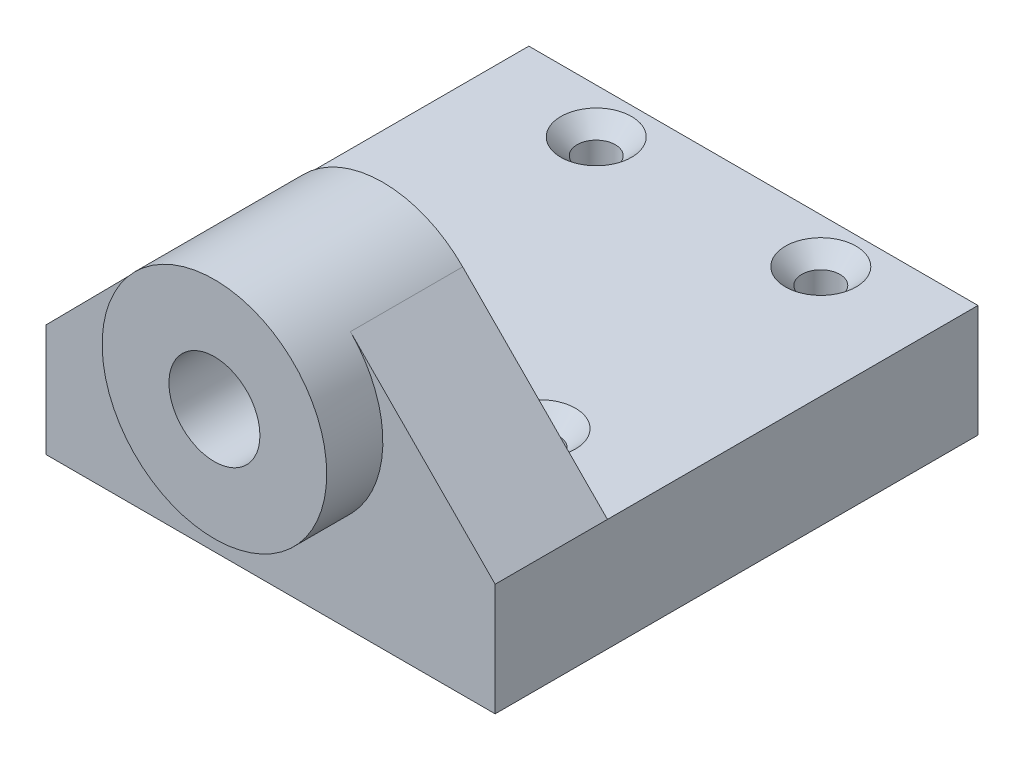
ISO-10303-21;
HEADER;
FILE_DESCRIPTION(('STEP AP214'),'2;1');
FILE_NAME('part.step','',(''),(''),'','','');
FILE_SCHEMA(('AUTOMOTIVE_DESIGN { 1 0 10303 214 1 1 1 1 }'));
ENDSEC;
DATA;
#1=APPLICATION_CONTEXT('core data for automotive mechanical design processes');
#2=APPLICATION_PROTOCOL_DEFINITION('international standard','automotive_design',2000,#1);
#3=PRODUCT_CONTEXT('',#1,'mechanical');
#4=PRODUCT('Part','Part','',(#3));
#5=PRODUCT_RELATED_PRODUCT_CATEGORY('part','',(#4));
#6=PRODUCT_DEFINITION_FORMATION('','',#4);
#7=PRODUCT_DEFINITION_CONTEXT('part definition',#1,'design');
#8=PRODUCT_DEFINITION('design','',#6,#7);
#9=PRODUCT_DEFINITION_SHAPE('','',#8);
#10=(LENGTH_UNIT() NAMED_UNIT(*) SI_UNIT(.MILLI.,.METRE.));
#11=(NAMED_UNIT(*) PLANE_ANGLE_UNIT() SI_UNIT($,.RADIAN.));
#12=(NAMED_UNIT(*) SI_UNIT($,.STERADIAN.) SOLID_ANGLE_UNIT());
#13=UNCERTAINTY_MEASURE_WITH_UNIT(LENGTH_MEASURE(1.E-05),#10,'distance_accuracy_value','');
#14=(GEOMETRIC_REPRESENTATION_CONTEXT(3) GLOBAL_UNCERTAINTY_ASSIGNED_CONTEXT((#13)) GLOBAL_UNIT_ASSIGNED_CONTEXT((#10,
#11,#12)) REPRESENTATION_CONTEXT('',''));
#15=CARTESIAN_POINT('',(0.,0.,0.));
#16=DIRECTION('',(0.,0.,1.));
#17=DIRECTION('',(1.,0.,0.));
#18=AXIS2_PLACEMENT_3D('',#15,#16,#17);
#19=CARTESIAN_POINT('',(0.,10.,0.));
#20=DIRECTION('',(1.,0.,0.));
#21=DIRECTION('',(0.,0.,-1.));
#22=AXIS2_PLACEMENT_3D('',#19,#20,#21);
#23=PLANE('',#22);
#24=DIRECTION('',(0.,0.,1.));
#25=VECTOR('',#24,1.);
#26=CARTESIAN_POINT('',(0.,0.,0.));
#27=LINE('',#26,#25);
#28=CARTESIAN_POINT('',(0.,0.,-33.));
#29=VERTEX_POINT('',#28);
#30=CARTESIAN_POINT('',(0.,0.,10.));
#31=VERTEX_POINT('',#30);
#32=EDGE_CURVE('E127',#29,#31,#27,.T.);
#33=ORIENTED_EDGE('',*,*,#32,.T.);
#34=DIRECTION('',(0.,-1.,0.));
#35=VECTOR('',#34,1.);
#36=CARTESIAN_POINT('',(0.,10.,10.));
#37=LINE('',#36,#35);
#38=CARTESIAN_POINT('',(0.,10.,10.));
#39=VERTEX_POINT('',#38);
#40=EDGE_CURVE('E146',#39,#31,#37,.T.);
#41=ORIENTED_EDGE('',*,*,#40,.F.);
#42=DIRECTION('',(0.,0.,-1.));
#43=VECTOR('',#42,1.);
#44=CARTESIAN_POINT('',(0.,10.,10.));
#45=LINE('',#44,#43);
#46=CARTESIAN_POINT('',(0.,10.,0.));
#47=VERTEX_POINT('',#46);
#48=EDGE_CURVE('E113',#39,#47,#45,.T.);
#49=ORIENTED_EDGE('',*,*,#48,.T.);
#50=DIRECTION('',(0.,0.,1.));
#51=VECTOR('',#50,1.);
#52=CARTESIAN_POINT('',(0.,10.,0.));
#53=LINE('',#52,#51);
#54=CARTESIAN_POINT('',(0.,10.,-33.));
#55=VERTEX_POINT('',#54);
#56=EDGE_CURVE('E119',#55,#47,#53,.T.);
#57=ORIENTED_EDGE('',*,*,#56,.F.);
#58=DIRECTION('',(0.,-1.,0.));
#59=VECTOR('',#58,1.);
#60=CARTESIAN_POINT('',(0.,10.,-33.));
#61=LINE('',#60,#59);
#62=EDGE_CURVE('E123',#55,#29,#61,.T.);
#63=ORIENTED_EDGE('',*,*,#62,.T.);
#64=EDGE_LOOP('',(#33,#41,#49,#57,#63));
#65=FACE_BOUND('',#64,.T.);
#66=ADVANCED_FACE('F37',(#65),#23,.F.);
#67=CARTESIAN_POINT('',(40.,10.,0.));
#68=DIRECTION('',(-1.,0.,0.));
#69=DIRECTION('',(0.,0.,1.));
#70=AXIS2_PLACEMENT_3D('',#67,#68,#69);
#71=PLANE('',#70);
#72=DIRECTION('',(0.,0.,-1.));
#73=VECTOR('',#72,1.);
#74=CARTESIAN_POINT('',(40.,0.,0.));
#75=LINE('',#74,#73);
#76=CARTESIAN_POINT('',(40.,0.,10.));
#77=VERTEX_POINT('',#76);
#78=CARTESIAN_POINT('',(40.,0.,-33.));
#79=VERTEX_POINT('',#78);
#80=EDGE_CURVE('E66',#77,#79,#75,.T.);
#81=ORIENTED_EDGE('',*,*,#80,.T.);
#82=DIRECTION('',(0.,-1.,0.));
#83=VECTOR('',#82,1.);
#84=CARTESIAN_POINT('',(40.,10.,-33.));
#85=LINE('',#84,#83);
#86=CARTESIAN_POINT('',(40.,10.,-33.));
#87=VERTEX_POINT('',#86);
#88=EDGE_CURVE('E40',#87,#79,#85,.T.);
#89=ORIENTED_EDGE('',*,*,#88,.F.);
#90=DIRECTION('',(0.,0.,-1.));
#91=VECTOR('',#90,1.);
#92=CARTESIAN_POINT('',(40.,10.,0.));
#93=LINE('',#92,#91);
#94=CARTESIAN_POINT('',(40.,10.,0.));
#95=VERTEX_POINT('',#94);
#96=EDGE_CURVE('E117',#95,#87,#93,.T.);
#97=ORIENTED_EDGE('',*,*,#96,.F.);
#98=DIRECTION('',(0.,0.,-1.));
#99=VECTOR('',#98,1.);
#100=CARTESIAN_POINT('',(40.,10.,10.));
#101=LINE('',#100,#99);
#102=CARTESIAN_POINT('',(40.,10.,10.));
#103=VERTEX_POINT('',#102);
#104=EDGE_CURVE('E109',#103,#95,#101,.T.);
#105=ORIENTED_EDGE('',*,*,#104,.F.);
#106=DIRECTION('',(0.,1.,0.));
#107=VECTOR('',#106,1.);
#108=CARTESIAN_POINT('',(40.,0.,10.));
#109=LINE('',#108,#107);
#110=EDGE_CURVE('E153',#77,#103,#109,.T.);
#111=ORIENTED_EDGE('',*,*,#110,.F.);
#112=EDGE_LOOP('',(#81,#89,#97,#105,#111));
#113=FACE_BOUND('',#112,.T.);
#114=ADVANCED_FACE('F121',(#113),#71,.F.);
#115=CARTESIAN_POINT('',(0.,10.,-33.));
#116=DIRECTION('',(0.,0.,1.));
#117=DIRECTION('',(1.,0.,0.));
#118=AXIS2_PLACEMENT_3D('',#115,#116,#117);
#119=PLANE('',#118);
#120=DIRECTION('',(-1.,0.,0.));
#121=VECTOR('',#120,1.);
#122=CARTESIAN_POINT('',(0.,0.,-33.));
#123=LINE('',#122,#121);
#124=EDGE_CURVE('E131',#79,#29,#123,.T.);
#125=ORIENTED_EDGE('',*,*,#124,.T.);
#126=ORIENTED_EDGE('',*,*,#62,.F.);
#127=DIRECTION('',(-1.,0.,0.));
#128=VECTOR('',#127,1.);
#129=CARTESIAN_POINT('',(0.,10.,-33.));
#130=LINE('',#129,#128);
#131=EDGE_CURVE('E54',#87,#55,#130,.T.);
#132=ORIENTED_EDGE('',*,*,#131,.F.);
#133=ORIENTED_EDGE('',*,*,#88,.T.);
#134=EDGE_LOOP('',(#125,#126,#132,#133));
#135=FACE_BOUND('',#134,.T.);
#136=ADVANCED_FACE('F137',(#135),#119,.F.);
#137=CARTESIAN_POINT('',(0.,10.,0.));
#138=DIRECTION('',(0.,-1.,0.));
#139=DIRECTION('',(0.,0.,-1.));
#140=AXIS2_PLACEMENT_3D('',#137,#138,#139);
#141=PLANE('',#140);
#142=CARTESIAN_POINT('',(10.,10.,-29.));
#143=DIRECTION('',(0.,1.,0.));
#144=DIRECTION('',(0.,0.,1.));
#145=AXIS2_PLACEMENT_3D('',#142,#143,#144);
#146=CIRCLE('',#145,3.15);
#147=CARTESIAN_POINT('',(10.,10.,-25.85));
#148=VERTEX_POINT('',#147);
#149=EDGE_CURVE('E214',#148,#148,#146,.T.);
#150=ORIENTED_EDGE('',*,*,#149,.F.);
#151=EDGE_LOOP('',(#150));
#152=FACE_BOUND('',#151,.T.);
#153=CARTESIAN_POINT('',(30.,10.,-29.));
#154=DIRECTION('',(0.,1.,0.));
#155=DIRECTION('',(0.,0.,1.));
#156=AXIS2_PLACEMENT_3D('',#153,#154,#155);
#157=CIRCLE('',#156,3.15);
#158=CARTESIAN_POINT('',(30.,10.,-25.85));
#159=VERTEX_POINT('',#158);
#160=EDGE_CURVE('E205',#159,#159,#157,.T.);
#161=ORIENTED_EDGE('',*,*,#160,.F.);
#162=EDGE_LOOP('',(#161));
#163=FACE_BOUND('',#162,.T.);
#164=CARTESIAN_POINT('',(30.,10.,-4.));
#165=DIRECTION('',(0.,1.,0.));
#166=DIRECTION('',(0.,0.,1.));
#167=AXIS2_PLACEMENT_3D('',#164,#165,#166);
#168=CIRCLE('',#167,3.15);
#169=CARTESIAN_POINT('',(30.,10.,-0.85));
#170=VERTEX_POINT('',#169);
#171=EDGE_CURVE('E196',#170,#170,#168,.T.);
#172=ORIENTED_EDGE('',*,*,#171,.F.);
#173=EDGE_LOOP('',(#172));
#174=FACE_BOUND('',#173,.T.);
#175=CARTESIAN_POINT('',(10.,10.,-4.));
#176=DIRECTION('',(0.,1.,0.));
#177=DIRECTION('',(0.,0.,1.));
#178=AXIS2_PLACEMENT_3D('',#175,#176,#177);
#179=CIRCLE('',#178,3.15);
#180=CARTESIAN_POINT('',(10.,10.,-0.85));
#181=VERTEX_POINT('',#180);
#182=EDGE_CURVE('E187',#181,#181,#179,.T.);
#183=ORIENTED_EDGE('',*,*,#182,.F.);
#184=EDGE_LOOP('',(#183));
#185=FACE_BOUND('',#184,.T.);
#186=ORIENTED_EDGE('',*,*,#56,.T.);
#187=DIRECTION('',(1.,0.,0.));
#188=VECTOR('',#187,1.);
#189=CARTESIAN_POINT('',(0.,10.,0.));
#190=LINE('',#189,#188);
#191=EDGE_CURVE('E99',#47,#95,#190,.T.);
#192=ORIENTED_EDGE('',*,*,#191,.T.);
#193=ORIENTED_EDGE('',*,*,#96,.T.);
#194=ORIENTED_EDGE('',*,*,#131,.T.);
#195=EDGE_LOOP('',(#186,#192,#193,#194));
#196=FACE_BOUND('',#195,.T.);
#197=ADVANCED_FACE('F116',(#152,#163,#174,#185,#196),#141,.F.);
#198=CARTESIAN_POINT('',(0.,0.,0.));
#199=DIRECTION('',(0.,-1.,0.));
#200=DIRECTION('',(0.,0.,-1.));
#201=AXIS2_PLACEMENT_3D('',#198,#199,#200);
#202=PLANE('',#201);
#203=CARTESIAN_POINT('',(10.,0.,-29.));
#204=DIRECTION('',(0.,1.,0.));
#205=DIRECTION('',(0.,0.,1.));
#206=AXIS2_PLACEMENT_3D('',#203,#204,#205);
#207=CIRCLE('',#206,1.7);
#208=CARTESIAN_POINT('',(10.,0.,-27.3));
#209=VERTEX_POINT('',#208);
#210=EDGE_CURVE('E220',#209,#209,#207,.T.);
#211=ORIENTED_EDGE('',*,*,#210,.T.);
#212=EDGE_LOOP('',(#211));
#213=FACE_BOUND('',#212,.T.);
#214=CARTESIAN_POINT('',(30.,0.,-29.));
#215=DIRECTION('',(0.,1.,0.));
#216=DIRECTION('',(0.,0.,1.));
#217=AXIS2_PLACEMENT_3D('',#214,#215,#216);
#218=CIRCLE('',#217,1.7);
#219=CARTESIAN_POINT('',(30.,0.,-27.3));
#220=VERTEX_POINT('',#219);
#221=EDGE_CURVE('E211',#220,#220,#218,.T.);
#222=ORIENTED_EDGE('',*,*,#221,.T.);
#223=EDGE_LOOP('',(#222));
#224=FACE_BOUND('',#223,.T.);
#225=CARTESIAN_POINT('',(30.,0.,-4.));
#226=DIRECTION('',(0.,1.,0.));
#227=DIRECTION('',(0.,0.,1.));
#228=AXIS2_PLACEMENT_3D('',#225,#226,#227);
#229=CIRCLE('',#228,1.7);
#230=CARTESIAN_POINT('',(30.,0.,-2.3));
#231=VERTEX_POINT('',#230);
#232=EDGE_CURVE('E202',#231,#231,#229,.T.);
#233=ORIENTED_EDGE('',*,*,#232,.T.);
#234=EDGE_LOOP('',(#233));
#235=FACE_BOUND('',#234,.T.);
#236=CARTESIAN_POINT('',(10.,0.,-4.));
#237=DIRECTION('',(0.,1.,0.));
#238=DIRECTION('',(0.,0.,1.));
#239=AXIS2_PLACEMENT_3D('',#236,#237,#238);
#240=CIRCLE('',#239,1.7);
#241=CARTESIAN_POINT('',(10.,0.,-2.3));
#242=VERTEX_POINT('',#241);
#243=EDGE_CURVE('E193',#242,#242,#240,.T.);
#244=ORIENTED_EDGE('',*,*,#243,.T.);
#245=EDGE_LOOP('',(#244));
#246=FACE_BOUND('',#245,.T.);
#247=ORIENTED_EDGE('',*,*,#32,.F.);
#248=ORIENTED_EDGE('',*,*,#124,.F.);
#249=ORIENTED_EDGE('',*,*,#80,.F.);
#250=DIRECTION('',(1.,0.,0.));
#251=VECTOR('',#250,1.);
#252=CARTESIAN_POINT('',(0.,0.,10.));
#253=LINE('',#252,#251);
#254=EDGE_CURVE('E143',#31,#77,#253,.T.);
#255=ORIENTED_EDGE('',*,*,#254,.F.);
#256=EDGE_LOOP('',(#247,#248,#249,#255));
#257=FACE_BOUND('',#256,.T.);
#258=ADVANCED_FACE('F139',(#213,#224,#235,#246,#257),#202,.T.);
#259=CARTESIAN_POINT('',(0.,10.,10.));
#260=DIRECTION('',(0.710967469447111,-0.703224898157035,0.));
#261=DIRECTION('',(0.703224898157035,0.710967469447111,0.));
#262=AXIS2_PLACEMENT_3D('',#259,#260,#261);
#263=PLANE('',#262);
#264=DIRECTION('',(-0.703224898157035,-0.710967469447111,0.));
#265=VECTOR('',#264,1.);
#266=CARTESIAN_POINT('',(0.,10.,0.));
#267=LINE('',#266,#265);
#268=CARTESIAN_POINT('',(12.8903253055289,23.0322489815704,0.));
#269=VERTEX_POINT('',#268);
#270=EDGE_CURVE('E105',#269,#47,#267,.T.);
#271=ORIENTED_EDGE('',*,*,#270,.T.);
#272=ORIENTED_EDGE('',*,*,#48,.F.);
#273=DIRECTION('',(-0.703224898157035,-0.710967469447111,0.));
#274=VECTOR('',#273,1.);
#275=CARTESIAN_POINT('',(0.,10.,10.));
#276=LINE('',#275,#274);
#277=CARTESIAN_POINT('',(12.8903253055289,23.0322489815704,10.));
#278=VERTEX_POINT('',#277);
#279=EDGE_CURVE('E150',#278,#39,#276,.T.);
#280=ORIENTED_EDGE('',*,*,#279,.F.);
#281=DIRECTION('',(0.,0.,-1.));
#282=VECTOR('',#281,1.);
#283=CARTESIAN_POINT('',(12.8903253055289,23.0322489815704,10.));
#284=LINE('',#283,#282);
#285=EDGE_CURVE('E159',#278,#269,#284,.T.);
#286=ORIENTED_EDGE('',*,*,#285,.T.);
#287=EDGE_LOOP('',(#271,#272,#280,#286));
#288=FACE_BOUND('',#287,.T.);
#289=ADVANCED_FACE('F168',(#288),#263,.F.);
#290=CARTESIAN_POINT('',(40.,10.,10.));
#291=DIRECTION('',(-0.710967469447111,-0.703224898157035,0.));
#292=DIRECTION('',(0.703224898157035,-0.710967469447111,0.));
#293=AXIS2_PLACEMENT_3D('',#290,#291,#292);
#294=PLANE('',#293);
#295=DIRECTION('',(-0.703224898157035,0.710967469447111,0.));
#296=VECTOR('',#295,1.);
#297=CARTESIAN_POINT('',(40.,10.,0.));
#298=LINE('',#297,#296);
#299=CARTESIAN_POINT('',(27.1096746944711,23.0322489815704,0.));
#300=VERTEX_POINT('',#299);
#301=EDGE_CURVE('E94',#95,#300,#298,.T.);
#302=ORIENTED_EDGE('',*,*,#301,.T.);
#303=DIRECTION('',(0.,0.,-1.));
#304=VECTOR('',#303,1.);
#305=CARTESIAN_POINT('',(27.1096746944711,23.0322489815704,10.));
#306=LINE('',#305,#304);
#307=CARTESIAN_POINT('',(27.1096746944711,23.0322489815704,10.));
#308=VERTEX_POINT('',#307);
#309=EDGE_CURVE('E114',#308,#300,#306,.T.);
#310=ORIENTED_EDGE('',*,*,#309,.F.);
#311=DIRECTION('',(-0.703224898157035,0.710967469447111,0.));
#312=VECTOR('',#311,1.);
#313=CARTESIAN_POINT('',(40.,10.,10.));
#314=LINE('',#313,#312);
#315=EDGE_CURVE('E111',#103,#308,#314,.T.);
#316=ORIENTED_EDGE('',*,*,#315,.F.);
#317=ORIENTED_EDGE('',*,*,#104,.T.);
#318=EDGE_LOOP('',(#302,#310,#316,#317));
#319=FACE_BOUND('',#318,.T.);
#320=ADVANCED_FACE('F110',(#319),#294,.F.);
#321=CARTESIAN_POINT('',(20.,16.,10.));
#322=DIRECTION('',(0.,0.,-1.));
#323=DIRECTION('',(-1.,0.,0.));
#324=AXIS2_PLACEMENT_3D('',#321,#322,#323);
#325=CYLINDRICAL_SURFACE('',#324,10.);
#326=CARTESIAN_POINT('',(20.,16.,0.));
#327=DIRECTION('',(0.,0.,1.));
#328=DIRECTION('',(1.,0.,0.));
#329=AXIS2_PLACEMENT_3D('',#326,#327,#328);
#330=CIRCLE('',#329,10.);
#331=EDGE_CURVE('E101',#300,#269,#330,.T.);
#332=ORIENTED_EDGE('',*,*,#331,.T.);
#333=ORIENTED_EDGE('',*,*,#285,.F.);
#334=CARTESIAN_POINT('',(20.,16.,10.));
#335=DIRECTION('',(0.,0.,1.));
#336=DIRECTION('',(1.,0.,0.));
#337=AXIS2_PLACEMENT_3D('',#334,#335,#336);
#338=CIRCLE('',#337,10.);
#339=EDGE_CURVE('E12',#278,#308,#338,.T.);
#340=ORIENTED_EDGE('',*,*,#339,.T.);
#341=ORIENTED_EDGE('',*,*,#309,.T.);
#342=EDGE_LOOP('',(#332,#333,#340,#341));
#343=FACE_BOUND('',#342,.T.);
#344=CARTESIAN_POINT('',(20.,16.,15.));
#345=DIRECTION('',(0.,0.,1.));
#346=DIRECTION('',(1.,0.,0.));
#347=AXIS2_PLACEMENT_3D('',#344,#345,#346);
#348=CIRCLE('',#347,10.);
#349=CARTESIAN_POINT('',(30.,16.,15.));
#350=VERTEX_POINT('',#349);
#351=EDGE_CURVE('E161',#350,#350,#348,.T.);
#352=ORIENTED_EDGE('',*,*,#351,.F.);
#353=EDGE_LOOP('',(#352));
#354=FACE_BOUND('',#353,.T.);
#355=ADVANCED_FACE('F170',(#343,#354),#325,.T.);
#356=CARTESIAN_POINT('',(20.,16.,10.));
#357=DIRECTION('',(0.,0.,1.));
#358=DIRECTION('',(1.,0.,0.));
#359=AXIS2_PLACEMENT_3D('',#356,#357,#358);
#360=PLANE('',#359);
#361=ORIENTED_EDGE('',*,*,#339,.F.);
#362=ORIENTED_EDGE('',*,*,#279,.T.);
#363=ORIENTED_EDGE('',*,*,#40,.T.);
#364=ORIENTED_EDGE('',*,*,#254,.T.);
#365=ORIENTED_EDGE('',*,*,#110,.T.);
#366=ORIENTED_EDGE('',*,*,#315,.T.);
#367=EDGE_LOOP('',(#361,#362,#363,#364,#365,#366));
#368=FACE_BOUND('',#367,.T.);
#369=ADVANCED_FACE('F148',(#368),#360,.T.);
#370=CARTESIAN_POINT('',(20.,16.,0.));
#371=DIRECTION('',(0.,0.,1.));
#372=DIRECTION('',(1.,0.,0.));
#373=AXIS2_PLACEMENT_3D('',#370,#371,#372);
#374=PLANE('',#373);
#375=ORIENTED_EDGE('',*,*,#191,.F.);
#376=ORIENTED_EDGE('',*,*,#270,.F.);
#377=ORIENTED_EDGE('',*,*,#331,.F.);
#378=ORIENTED_EDGE('',*,*,#301,.F.);
#379=EDGE_LOOP('',(#375,#376,#377,#378));
#380=FACE_BOUND('',#379,.T.);
#381=ADVANCED_FACE('F96',(#380),#374,.F.);
#382=CARTESIAN_POINT('',(20.,16.,15.));
#383=DIRECTION('',(0.,0.,1.));
#384=DIRECTION('',(1.,0.,0.));
#385=AXIS2_PLACEMENT_3D('',#382,#383,#384);
#386=PLANE('',#385);
#387=CARTESIAN_POINT('',(20.,16.,15.));
#388=DIRECTION('',(0.,0.,1.));
#389=DIRECTION('',(1.,0.,0.));
#390=AXIS2_PLACEMENT_3D('',#387,#388,#389);
#391=CIRCLE('',#390,4.05);
#392=CARTESIAN_POINT('',(24.05,16.,15.));
#393=VERTEX_POINT('',#392);
#394=EDGE_CURVE('E179',#393,#393,#391,.T.);
#395=ORIENTED_EDGE('',*,*,#394,.F.);
#396=EDGE_LOOP('',(#395));
#397=FACE_BOUND('',#396,.T.);
#398=ORIENTED_EDGE('',*,*,#351,.T.);
#399=EDGE_LOOP('',(#398));
#400=FACE_BOUND('',#399,.T.);
#401=ADVANCED_FACE('F282',(#397,#400),#386,.T.);
#402=CARTESIAN_POINT('',(20.,16.,15.));
#403=DIRECTION('',(0.,0.,1.));
#404=DIRECTION('',(1.,0.,0.));
#405=AXIS2_PLACEMENT_3D('',#402,#403,#404);
#406=CYLINDRICAL_SURFACE('',#405,4.05);
#407=CARTESIAN_POINT('',(20.,16.,2.));
#408=DIRECTION('',(0.,0.,1.));
#409=DIRECTION('',(1.,0.,0.));
#410=AXIS2_PLACEMENT_3D('',#407,#408,#409);
#411=CIRCLE('',#410,4.05);
#412=CARTESIAN_POINT('',(24.05,16.,2.));
#413=VERTEX_POINT('',#412);
#414=EDGE_CURVE('E182',#413,#413,#411,.T.);
#415=ORIENTED_EDGE('',*,*,#414,.F.);
#416=EDGE_LOOP('',(#415));
#417=FACE_BOUND('',#416,.T.);
#418=ORIENTED_EDGE('',*,*,#394,.T.);
#419=EDGE_LOOP('',(#418));
#420=FACE_BOUND('',#419,.T.);
#421=ADVANCED_FACE('F261',(#417,#420),#406,.F.);
#422=CARTESIAN_POINT('',(24.05,16.,2.));
#423=DIRECTION('',(0.,0.,-1.));
#424=DIRECTION('',(-1.,0.,0.));
#425=AXIS2_PLACEMENT_3D('',#422,#423,#424);
#426=PLANE('',#425);
#427=ORIENTED_EDGE('',*,*,#414,.T.);
#428=EDGE_LOOP('',(#427));
#429=FACE_BOUND('',#428,.T.);
#430=ADVANCED_FACE('F251',(#429),#426,.F.);
#431=CARTESIAN_POINT('',(10.,10.,-4.));
#432=DIRECTION('',(0.,1.,0.));
#433=DIRECTION('',(0.,0.,1.));
#434=AXIS2_PLACEMENT_3D('',#431,#432,#433);
#435=CONICAL_SURFACE('',#434,3.15,0.785398163397448);
#436=CARTESIAN_POINT('',(10.,8.55,-4.));
#437=DIRECTION('',(0.,1.,0.));
#438=DIRECTION('',(0.,0.,1.));
#439=AXIS2_PLACEMENT_3D('',#436,#437,#438);
#440=CIRCLE('',#439,1.7);
#441=CARTESIAN_POINT('',(10.,8.55,-2.3));
#442=VERTEX_POINT('',#441);
#443=EDGE_CURVE('E190',#442,#442,#440,.T.);
#444=ORIENTED_EDGE('',*,*,#443,.F.);
#445=EDGE_LOOP('',(#444));
#446=FACE_BOUND('',#445,.T.);
#447=ORIENTED_EDGE('',*,*,#182,.T.);
#448=EDGE_LOOP('',(#447));
#449=FACE_BOUND('',#448,.T.);
#450=ADVANCED_FACE('F248',(#446,#449),#435,.F.);
#451=CARTESIAN_POINT('',(10.,10.,-4.));
#452=DIRECTION('',(0.,1.,0.));
#453=DIRECTION('',(0.,0.,1.));
#454=AXIS2_PLACEMENT_3D('',#451,#452,#453);
#455=CYLINDRICAL_SURFACE('',#454,1.7);
#456=ORIENTED_EDGE('',*,*,#243,.F.);
#457=EDGE_LOOP('',(#456));
#458=FACE_BOUND('',#457,.T.);
#459=ORIENTED_EDGE('',*,*,#443,.T.);
#460=EDGE_LOOP('',(#459));
#461=FACE_BOUND('',#460,.T.);
#462=ADVANCED_FACE('F250',(#458,#461),#455,.F.);
#463=CARTESIAN_POINT('',(30.,10.,-4.));
#464=DIRECTION('',(0.,1.,0.));
#465=DIRECTION('',(0.,0.,1.));
#466=AXIS2_PLACEMENT_3D('',#463,#464,#465);
#467=CONICAL_SURFACE('',#466,3.15,0.785398163397448);
#468=CARTESIAN_POINT('',(30.,8.55,-4.));
#469=DIRECTION('',(0.,1.,0.));
#470=DIRECTION('',(0.,0.,1.));
#471=AXIS2_PLACEMENT_3D('',#468,#469,#470);
#472=CIRCLE('',#471,1.7);
#473=CARTESIAN_POINT('',(30.,8.55,-2.3));
#474=VERTEX_POINT('',#473);
#475=EDGE_CURVE('E199',#474,#474,#472,.T.);
#476=ORIENTED_EDGE('',*,*,#475,.F.);
#477=EDGE_LOOP('',(#476));
#478=FACE_BOUND('',#477,.T.);
#479=ORIENTED_EDGE('',*,*,#171,.T.);
#480=EDGE_LOOP('',(#479));
#481=FACE_BOUND('',#480,.T.);
#482=ADVANCED_FACE('F258',(#478,#481),#467,.F.);
#483=CARTESIAN_POINT('',(30.,10.,-4.));
#484=DIRECTION('',(0.,1.,0.));
#485=DIRECTION('',(0.,0.,1.));
#486=AXIS2_PLACEMENT_3D('',#483,#484,#485);
#487=CYLINDRICAL_SURFACE('',#486,1.7);
#488=ORIENTED_EDGE('',*,*,#232,.F.);
#489=EDGE_LOOP('',(#488));
#490=FACE_BOUND('',#489,.T.);
#491=ORIENTED_EDGE('',*,*,#475,.T.);
#492=EDGE_LOOP('',(#491));
#493=FACE_BOUND('',#492,.T.);
#494=ADVANCED_FACE('F336',(#490,#493),#487,.F.);
#495=CARTESIAN_POINT('',(30.,10.,-29.));
#496=DIRECTION('',(0.,1.,0.));
#497=DIRECTION('',(0.,0.,1.));
#498=AXIS2_PLACEMENT_3D('',#495,#496,#497);
#499=CONICAL_SURFACE('',#498,3.15,0.785398163397448);
#500=CARTESIAN_POINT('',(30.,8.55,-29.));
#501=DIRECTION('',(0.,1.,0.));
#502=DIRECTION('',(0.,0.,1.));
#503=AXIS2_PLACEMENT_3D('',#500,#501,#502);
#504=CIRCLE('',#503,1.7);
#505=CARTESIAN_POINT('',(30.,8.55,-27.3));
#506=VERTEX_POINT('',#505);
#507=EDGE_CURVE('E208',#506,#506,#504,.T.);
#508=ORIENTED_EDGE('',*,*,#507,.F.);
#509=EDGE_LOOP('',(#508));
#510=FACE_BOUND('',#509,.T.);
#511=ORIENTED_EDGE('',*,*,#160,.T.);
#512=EDGE_LOOP('',(#511));
#513=FACE_BOUND('',#512,.T.);
#514=ADVANCED_FACE('F346',(#510,#513),#499,.F.);
#515=CARTESIAN_POINT('',(30.,10.,-29.));
#516=DIRECTION('',(0.,1.,0.));
#517=DIRECTION('',(0.,0.,1.));
#518=AXIS2_PLACEMENT_3D('',#515,#516,#517);
#519=CYLINDRICAL_SURFACE('',#518,1.7);
#520=ORIENTED_EDGE('',*,*,#221,.F.);
#521=EDGE_LOOP('',(#520));
#522=FACE_BOUND('',#521,.T.);
#523=ORIENTED_EDGE('',*,*,#507,.T.);
#524=EDGE_LOOP('',(#523));
#525=FACE_BOUND('',#524,.T.);
#526=ADVANCED_FACE('F235',(#522,#525),#519,.F.);
#527=CARTESIAN_POINT('',(10.,10.,-29.));
#528=DIRECTION('',(0.,1.,0.));
#529=DIRECTION('',(0.,0.,1.));
#530=AXIS2_PLACEMENT_3D('',#527,#528,#529);
#531=CONICAL_SURFACE('',#530,3.15,0.785398163397448);
#532=CARTESIAN_POINT('',(10.,8.55,-29.));
#533=DIRECTION('',(0.,1.,0.));
#534=DIRECTION('',(0.,0.,1.));
#535=AXIS2_PLACEMENT_3D('',#532,#533,#534);
#536=CIRCLE('',#535,1.7);
#537=CARTESIAN_POINT('',(10.,8.55,-27.3));
#538=VERTEX_POINT('',#537);
#539=EDGE_CURVE('E217',#538,#538,#536,.T.);
#540=ORIENTED_EDGE('',*,*,#539,.F.);
#541=EDGE_LOOP('',(#540));
#542=FACE_BOUND('',#541,.T.);
#543=ORIENTED_EDGE('',*,*,#149,.T.);
#544=EDGE_LOOP('',(#543));
#545=FACE_BOUND('',#544,.T.);
#546=ADVANCED_FACE('F229',(#542,#545),#531,.F.);
#547=CARTESIAN_POINT('',(10.,10.,-29.));
#548=DIRECTION('',(0.,1.,0.));
#549=DIRECTION('',(0.,0.,1.));
#550=AXIS2_PLACEMENT_3D('',#547,#548,#549);
#551=CYLINDRICAL_SURFACE('',#550,1.7);
#552=ORIENTED_EDGE('',*,*,#210,.F.);
#553=EDGE_LOOP('',(#552));
#554=FACE_BOUND('',#553,.T.);
#555=ORIENTED_EDGE('',*,*,#539,.T.);
#556=EDGE_LOOP('',(#555));
#557=FACE_BOUND('',#556,.T.);
#558=ADVANCED_FACE('F226',(#554,#557),#551,.F.);
#559=CLOSED_SHELL('',(#66,#114,#136,#197,#258,#289,#320,#355,#369,#381,#401,#421,#430,#450,#462,
#482,#494,#514,#526,#546,#558));
#560=MANIFOLD_SOLID_BREP('B2',#559);
#561=ADVANCED_BREP_SHAPE_REPRESENTATION('',(#18,#560),#14);
#562=SHAPE_DEFINITION_REPRESENTATION(#9,#561);
ENDSEC;
END-ISO-10303-21;
